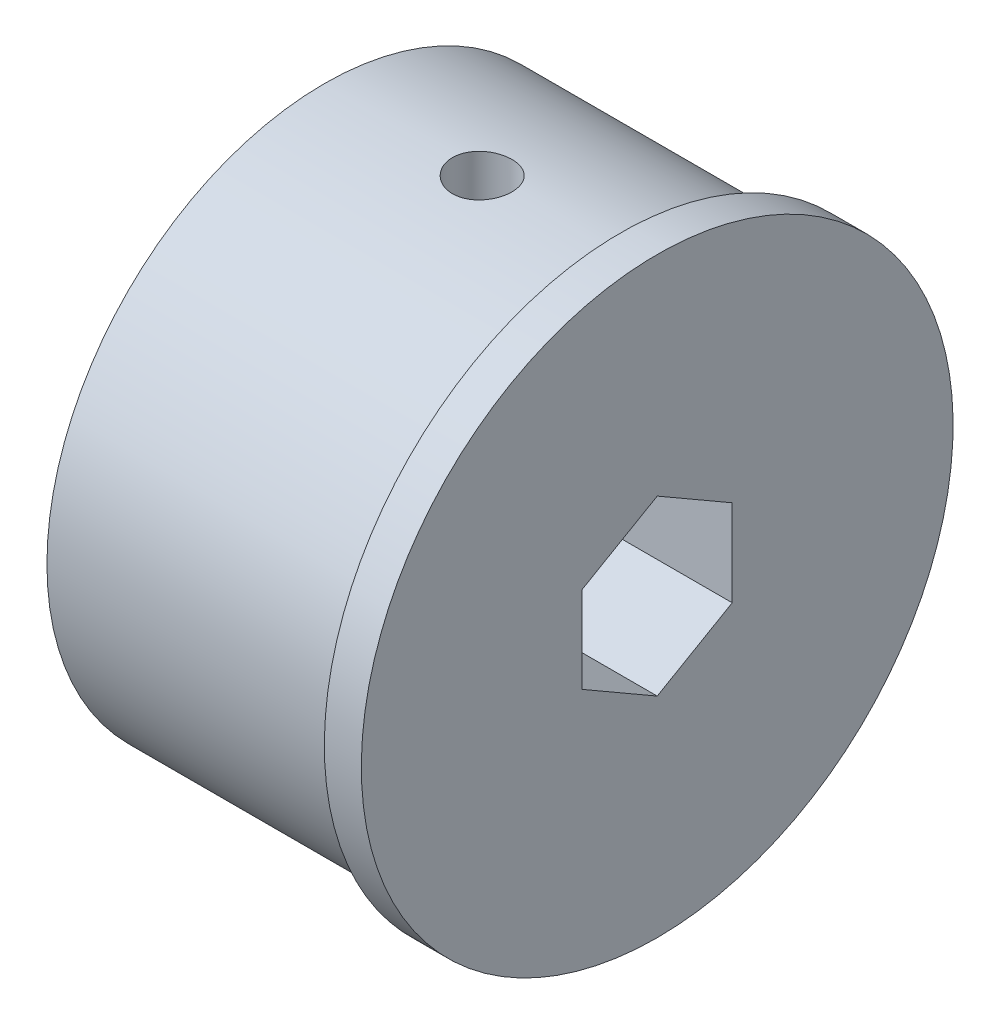
ISO-10303-21;
HEADER;
FILE_DESCRIPTION(('STEP AP214'),'2;1');
FILE_NAME('part.step','',(''),(''),'','','');
FILE_SCHEMA(('AUTOMOTIVE_DESIGN { 1 0 10303 214 1 1 1 1 }'));
ENDSEC;
DATA;
#1=APPLICATION_CONTEXT('core data for automotive mechanical design processes');
#2=APPLICATION_PROTOCOL_DEFINITION('international standard','automotive_design',2000,#1);
#3=PRODUCT_CONTEXT('',#1,'mechanical');
#4=PRODUCT('Part','Part','',(#3));
#5=PRODUCT_RELATED_PRODUCT_CATEGORY('part','',(#4));
#6=PRODUCT_DEFINITION_FORMATION('','',#4);
#7=PRODUCT_DEFINITION_CONTEXT('part definition',#1,'design');
#8=PRODUCT_DEFINITION('design','',#6,#7);
#9=PRODUCT_DEFINITION_SHAPE('','',#8);
#10=(LENGTH_UNIT() NAMED_UNIT(*) SI_UNIT(.MILLI.,.METRE.));
#11=(NAMED_UNIT(*) PLANE_ANGLE_UNIT() SI_UNIT($,.RADIAN.));
#12=(NAMED_UNIT(*) SI_UNIT($,.STERADIAN.) SOLID_ANGLE_UNIT());
#13=UNCERTAINTY_MEASURE_WITH_UNIT(LENGTH_MEASURE(1.E-05),#10,'distance_accuracy_value','');
#14=(GEOMETRIC_REPRESENTATION_CONTEXT(3) GLOBAL_UNCERTAINTY_ASSIGNED_CONTEXT((#13)) GLOBAL_UNIT_ASSIGNED_CONTEXT((#10,
#11,#12)) REPRESENTATION_CONTEXT('',''));
#15=CARTESIAN_POINT('',(0.,0.,0.));
#16=DIRECTION('',(0.,0.,1.));
#17=DIRECTION('',(1.,0.,0.));
#18=AXIS2_PLACEMENT_3D('',#15,#16,#17);
#19=CARTESIAN_POINT('',(280.9875,67.5337049223977,336.106505881662));
#20=DIRECTION('',(-1.,0.,0.));
#21=DIRECTION('',(0.,-1.,0.));
#22=AXIS2_PLACEMENT_3D('',#19,#20,#21);
#23=PLANE('',#22);
#24=DIRECTION('',(0.,0.5,0.866025403784442));
#25=VECTOR('',#24,1.);
#26=CARTESIAN_POINT('',(280.9875,61.9586663855354,339.325255881662));
#27=LINE('',#26,#25);
#28=CARTESIAN_POINT('',(280.9875,60.1003202065813,336.106505881662));
#29=VERTEX_POINT('',#28);
#30=CARTESIAN_POINT('',(280.9875,63.8170125644895,342.544005881662));
#31=VERTEX_POINT('',#30);
#32=EDGE_CURVE('E303',#29,#31,#27,.T.);
#33=ORIENTED_EDGE('',*,*,#32,.F.);
#34=DIRECTION('',(0.,-0.500000000000006,0.866025403784435));
#35=VECTOR('',#34,1.);
#36=CARTESIAN_POINT('',(280.9875,61.9586663855353,332.887755881662));
#37=LINE('',#36,#35);
#38=CARTESIAN_POINT('',(280.9875,63.8170125644894,329.669005881662));
#39=VERTEX_POINT('',#38);
#40=EDGE_CURVE('E145',#39,#29,#37,.T.);
#41=ORIENTED_EDGE('',*,*,#40,.F.);
#42=DIRECTION('',(0.,-1.,0.));
#43=VECTOR('',#42,1.);
#44=CARTESIAN_POINT('',(280.9875,67.5337049223977,329.669005881662));
#45=LINE('',#44,#43);
#46=CARTESIAN_POINT('',(280.9875,71.2503972803059,329.669005881662));
#47=VERTEX_POINT('',#46);
#48=EDGE_CURVE('E155',#47,#39,#45,.T.);
#49=ORIENTED_EDGE('',*,*,#48,.F.);
#50=DIRECTION('',(0.,-0.5,-0.866025403784442));
#51=VECTOR('',#50,1.);
#52=CARTESIAN_POINT('',(280.9875,73.10874345926,332.887755881662));
#53=LINE('',#52,#51);
#54=CARTESIAN_POINT('',(280.9875,74.9670896382141,336.106505881662));
#55=VERTEX_POINT('',#54);
#56=EDGE_CURVE('E322',#55,#47,#53,.T.);
#57=ORIENTED_EDGE('',*,*,#56,.F.);
#58=DIRECTION('',(0.,0.5,-0.866025403784436));
#59=VECTOR('',#58,1.);
#60=CARTESIAN_POINT('',(280.9875,73.10874345926,339.325255881662));
#61=LINE('',#60,#59);
#62=CARTESIAN_POINT('',(280.9875,71.2503972803059,342.544005881662));
#63=VERTEX_POINT('',#62);
#64=EDGE_CURVE('E315',#63,#55,#61,.T.);
#65=ORIENTED_EDGE('',*,*,#64,.F.);
#66=DIRECTION('',(0.,1.,0.));
#67=VECTOR('',#66,1.);
#68=CARTESIAN_POINT('',(280.9875,67.5337049223977,342.544005881662));
#69=LINE('',#68,#67);
#70=EDGE_CURVE('E309',#31,#63,#69,.T.);
#71=ORIENTED_EDGE('',*,*,#70,.F.);
#72=EDGE_LOOP('',(#33,#41,#49,#57,#65,#71));
#73=FACE_BOUND('',#72,.T.);
#74=CARTESIAN_POINT('',(280.9875,67.5337049223977,336.106505881662));
#75=DIRECTION('',(-1.,0.,0.));
#76=DIRECTION('',(0.,-1.,0.));
#77=AXIS2_PLACEMENT_3D('',#74,#75,#76);
#78=CIRCLE('',#77,23.8125);
#79=CARTESIAN_POINT('',(280.9875,43.7212049223977,336.106505881662));
#80=VERTEX_POINT('',#79);
#81=EDGE_CURVE('E211',#80,#80,#78,.T.);
#82=ORIENTED_EDGE('',*,*,#81,.T.);
#83=EDGE_LOOP('',(#82));
#84=FACE_BOUND('',#83,.T.);
#85=DIRECTION('',(0.,1.,0.));
#86=VECTOR('',#85,1.);
#87=CARTESIAN_POINT('',(280.9875,51.8587049223977,340.956505881662));
#88=LINE('',#87,#86);
#89=CARTESIAN_POINT('',(280.9875,50.0712049223977,340.956505881662));
#90=VERTEX_POINT('',#89);
#91=CARTESIAN_POINT('',(280.9875,53.6462049223974,340.956505881662));
#92=VERTEX_POINT('',#91);
#93=EDGE_CURVE('E242',#90,#92,#88,.T.);
#94=ORIENTED_EDGE('',*,*,#93,.F.);
#95=DIRECTION('',(0.,0.,-1.));
#96=VECTOR('',#95,1.);
#97=CARTESIAN_POINT('',(280.9875,50.0712049223974,336.106505881662));
#98=LINE('',#97,#96);
#99=CARTESIAN_POINT('',(280.9875,50.0712049223977,331.256505881662));
#100=VERTEX_POINT('',#99);
#101=EDGE_CURVE('E175',#90,#100,#98,.T.);
#102=ORIENTED_EDGE('',*,*,#101,.T.);
#103=DIRECTION('',(0.,1.,0.));
#104=VECTOR('',#103,1.);
#105=CARTESIAN_POINT('',(280.9875,51.8587049223977,331.256505881662));
#106=LINE('',#105,#104);
#107=CARTESIAN_POINT('',(280.9875,53.6462049223974,331.256505881662));
#108=VERTEX_POINT('',#107);
#109=EDGE_CURVE('E226',#100,#108,#106,.T.);
#110=ORIENTED_EDGE('',*,*,#109,.T.);
#111=DIRECTION('',(0.,0.,-1.));
#112=VECTOR('',#111,1.);
#113=CARTESIAN_POINT('',(280.9875,53.6462049223974,336.106505881662));
#114=LINE('',#113,#112);
#115=EDGE_CURVE('E246',#92,#108,#114,.T.);
#116=ORIENTED_EDGE('',*,*,#115,.F.);
#117=EDGE_LOOP('',(#94,#102,#110,#116));
#118=FACE_BOUND('',#117,.T.);
#119=DIRECTION('',(0.,0.,-1.));
#120=VECTOR('',#119,1.);
#121=CARTESIAN_POINT('',(280.9875,84.9962049223977,336.106505881662));
#122=LINE('',#121,#120);
#123=CARTESIAN_POINT('',(280.9875,84.9962049223977,340.956505881662));
#124=VERTEX_POINT('',#123);
#125=CARTESIAN_POINT('',(280.9875,84.9962049223977,331.256505881662));
#126=VERTEX_POINT('',#125);
#127=EDGE_CURVE('E202',#124,#126,#122,.T.);
#128=ORIENTED_EDGE('',*,*,#127,.F.);
#129=DIRECTION('',(0.,-1.,0.));
#130=VECTOR('',#129,1.);
#131=CARTESIAN_POINT('',(280.9875,83.2087049223977,340.956505881662));
#132=LINE('',#131,#130);
#133=CARTESIAN_POINT('',(280.9875,81.4212049223977,340.956505881662));
#134=VERTEX_POINT('',#133);
#135=EDGE_CURVE('E181',#124,#134,#132,.T.);
#136=ORIENTED_EDGE('',*,*,#135,.T.);
#137=DIRECTION('',(0.,0.,-1.));
#138=VECTOR('',#137,1.);
#139=CARTESIAN_POINT('',(280.9875,81.4212049223977,336.106505881662));
#140=LINE('',#139,#138);
#141=CARTESIAN_POINT('',(280.9875,81.4212049223977,331.256505881662));
#142=VERTEX_POINT('',#141);
#143=EDGE_CURVE('E194',#134,#142,#140,.T.);
#144=ORIENTED_EDGE('',*,*,#143,.T.);
#145=DIRECTION('',(0.,-1.,0.));
#146=VECTOR('',#145,1.);
#147=CARTESIAN_POINT('',(280.9875,83.2087049223977,331.256505881662));
#148=LINE('',#147,#146);
#149=EDGE_CURVE('E198',#126,#142,#148,.T.);
#150=ORIENTED_EDGE('',*,*,#149,.F.);
#151=EDGE_LOOP('',(#128,#136,#144,#150));
#152=FACE_BOUND('',#151,.T.);
#153=ADVANCED_FACE('F17',(#73,#84,#118,#152),#23,.T.);
#154=CARTESIAN_POINT('',(306.3875,67.5337049223977,336.106505881662));
#155=DIRECTION('',(1.,0.,0.));
#156=DIRECTION('',(0.,1.,0.));
#157=AXIS2_PLACEMENT_3D('',#154,#155,#156);
#158=CYLINDRICAL_SURFACE('',#157,25.4);
#159=CARTESIAN_POINT('',(306.3875,67.5337049223977,336.106505881662));
#160=DIRECTION('',(-1.,0.,0.));
#161=DIRECTION('',(0.,-1.,0.));
#162=AXIS2_PLACEMENT_3D('',#159,#160,#161);
#163=CIRCLE('',#162,25.4);
#164=CARTESIAN_POINT('',(306.3875,42.1337049223977,336.106505881662));
#165=VERTEX_POINT('',#164);
#166=EDGE_CURVE('E272',#165,#165,#163,.T.);
#167=ORIENTED_EDGE('',*,*,#166,.F.);
#168=EDGE_LOOP('',(#167));
#169=FACE_BOUND('',#168,.T.);
#170=CARTESIAN_POINT('',(309.5625,67.5337049223977,336.106505881662));
#171=DIRECTION('',(-1.,0.,0.));
#172=DIRECTION('',(0.,-1.,0.));
#173=AXIS2_PLACEMENT_3D('',#170,#171,#172);
#174=CIRCLE('',#173,25.4);
#175=CARTESIAN_POINT('',(309.5625,42.1337049223977,336.106505881662));
#176=VERTEX_POINT('',#175);
#177=EDGE_CURVE('E266',#176,#176,#174,.T.);
#178=ORIENTED_EDGE('',*,*,#177,.T.);
#179=EDGE_LOOP('',(#178));
#180=FACE_BOUND('',#179,.T.);
#181=ADVANCED_FACE('F19',(#169,#180),#158,.T.);
#182=CARTESIAN_POINT('',(306.3875,186.166852461199,298.45));
#183=DIRECTION('',(-1.,0.,0.));
#184=DIRECTION('',(0.,-1.,0.));
#185=AXIS2_PLACEMENT_3D('',#182,#183,#184);
#186=PLANE('',#185);
#187=CARTESIAN_POINT('',(306.3875,67.5337049223977,336.106505881662));
#188=DIRECTION('',(-1.,0.,0.));
#189=DIRECTION('',(0.,-1.,0.));
#190=AXIS2_PLACEMENT_3D('',#187,#188,#189);
#191=CIRCLE('',#190,23.8125);
#192=CARTESIAN_POINT('',(306.3875,43.7212049223977,336.106505881662));
#193=VERTEX_POINT('',#192);
#194=EDGE_CURVE('E267',#193,#193,#191,.T.);
#195=ORIENTED_EDGE('',*,*,#194,.F.);
#196=EDGE_LOOP('',(#195));
#197=FACE_BOUND('',#196,.T.);
#198=ORIENTED_EDGE('',*,*,#166,.T.);
#199=EDGE_LOOP('',(#198));
#200=FACE_BOUND('',#199,.T.);
#201=ADVANCED_FACE('F433',(#197,#200),#186,.T.);
#202=CARTESIAN_POINT('',(309.5625,186.166852461199,298.45));
#203=DIRECTION('',(-1.,0.,0.));
#204=DIRECTION('',(0.,-1.,0.));
#205=AXIS2_PLACEMENT_3D('',#202,#203,#204);
#206=PLANE('',#205);
#207=DIRECTION('',(0.,-0.500000000000006,0.866025403784435));
#208=VECTOR('',#207,1.);
#209=CARTESIAN_POINT('',(309.5625,107.922698625875,253.27571672066));
#210=LINE('',#209,#208);
#211=CARTESIAN_POINT('',(309.5625,63.8170125644894,329.669005881662));
#212=VERTEX_POINT('',#211);
#213=CARTESIAN_POINT('',(309.5625,60.1003202065812,336.106505881662));
#214=VERTEX_POINT('',#213);
#215=EDGE_CURVE('E271',#212,#214,#210,.T.);
#216=ORIENTED_EDGE('',*,*,#215,.T.);
#217=DIRECTION('',(0.,0.5,0.866025403784442));
#218=VECTOR('',#217,1.);
#219=CARTESIAN_POINT('',(309.5625,75.3112079145966,362.452536220169));
#220=LINE('',#219,#218);
#221=CARTESIAN_POINT('',(309.5625,63.8170125644895,342.544005881662));
#222=VERTEX_POINT('',#221);
#223=EDGE_CURVE('E26',#214,#222,#220,.T.);
#224=ORIENTED_EDGE('',*,*,#223,.T.);
#225=DIRECTION('',(0.,1.,0.));
#226=VECTOR('',#225,1.);
#227=CARTESIAN_POINT('',(309.5625,186.166852461199,342.544005881662));
#228=LINE('',#227,#226);
#229=CARTESIAN_POINT('',(309.5625,71.2503972803059,342.544005881662));
#230=VERTEX_POINT('',#229);
#231=EDGE_CURVE('E294',#222,#230,#228,.T.);
#232=ORIENTED_EDGE('',*,*,#231,.T.);
#233=DIRECTION('',(0.,0.5,-0.866025403784436));
#234=VECTOR('',#233,1.);
#235=CARTESIAN_POINT('',(309.5625,119.0727756996,259.713216720661));
#236=LINE('',#235,#234);
#237=CARTESIAN_POINT('',(309.5625,74.9670896382141,336.106505881662));
#238=VERTEX_POINT('',#237);
#239=EDGE_CURVE('E290',#230,#238,#236,.T.);
#240=ORIENTED_EDGE('',*,*,#239,.T.);
#241=DIRECTION('',(0.,-0.5,-0.866025403784442));
#242=VECTOR('',#241,1.);
#243=CARTESIAN_POINT('',(309.5625,86.4612849883213,356.01503622017));
#244=LINE('',#243,#242);
#245=CARTESIAN_POINT('',(309.5625,71.2503972803059,329.669005881662));
#246=VERTEX_POINT('',#245);
#247=EDGE_CURVE('E286',#238,#246,#244,.T.);
#248=ORIENTED_EDGE('',*,*,#247,.T.);
#249=DIRECTION('',(0.,-1.,0.));
#250=VECTOR('',#249,1.);
#251=CARTESIAN_POINT('',(309.5625,186.166852461199,329.669005881662));
#252=LINE('',#251,#250);
#253=EDGE_CURVE('E282',#246,#212,#252,.T.);
#254=ORIENTED_EDGE('',*,*,#253,.T.);
#255=EDGE_LOOP('',(#216,#224,#232,#240,#248,#254));
#256=FACE_BOUND('',#255,.T.);
#257=ORIENTED_EDGE('',*,*,#177,.F.);
#258=EDGE_LOOP('',(#257));
#259=FACE_BOUND('',#258,.T.);
#260=ADVANCED_FACE('F300',(#256,#259),#206,.F.);
#261=CARTESIAN_POINT('',(280.9875,67.5337049223977,336.106505881662));
#262=DIRECTION('',(1.,0.,0.));
#263=DIRECTION('',(0.,1.,0.));
#264=AXIS2_PLACEMENT_3D('',#261,#262,#263);
#265=CYLINDRICAL_SURFACE('',#264,23.8125);
#266=CARTESIAN_POINT('',(291.985538685969,91.3462049223977,336.106505881662));
#267=CARTESIAN_POINT('',(291.985544847417,91.3462031722386,335.963559626922));
#268=CARTESIAN_POINT('',(291.997586197786,91.3449041092848,335.820520235967));
#269=CARTESIAN_POINT('',(292.045437526688,91.3398468153479,335.538410963963));
#270=CARTESIAN_POINT('',(292.081273328868,91.3360859126418,335.399345567029));
#271=CARTESIAN_POINT('',(292.17565493709,91.3265292517013,335.129310060398));
#272=CARTESIAN_POINT('',(292.234186608062,91.3207347602062,334.998334970772));
#273=CARTESIAN_POINT('',(292.372270048498,91.3077579258004,334.748095360035));
#274=CARTESIAN_POINT('',(292.451817791344,91.3005758488178,334.628828601641));
#275=CARTESIAN_POINT('',(292.630025441006,91.2855946891096,334.404873879081));
#276=CARTESIAN_POINT('',(292.728754154696,91.277793446729,334.300240805865));
#277=CARTESIAN_POINT('',(292.942374085516,91.2624709422397,334.108995668204));
#278=CARTESIAN_POINT('',(293.057266069136,91.2549496934301,334.022384458869));
#279=CARTESIAN_POINT('',(293.300298662452,91.2410169691063,333.869444210491));
#280=CARTESIAN_POINT('',(293.428471028104,91.2346082564592,333.80316536055));
#281=CARTESIAN_POINT('',(293.694206359069,91.2236535562576,333.693091715532));
#282=CARTESIAN_POINT('',(293.831769059627,91.2191075162113,333.649296286843));
#283=CARTESIAN_POINT('',(294.111817233407,91.2124127673932,333.585596627741));
#284=CARTESIAN_POINT('',(294.254281658292,91.2102548739178,333.565600842409));
#285=CARTESIAN_POINT('',(294.540559459744,91.2085523616692,333.549784985192));
#286=CARTESIAN_POINT('',(294.684372795759,91.2090076645849,333.553964188843));
#287=CARTESIAN_POINT('',(294.968633138449,91.21247170691,333.586304300348));
#288=CARTESIAN_POINT('',(295.109091692955,91.2154697775931,333.61436500993));
#289=CARTESIAN_POINT('',(295.383294313009,91.2236648946824,333.693515572669));
#290=CARTESIAN_POINT('',(295.517038275678,91.2288619747691,333.744605778551));
#291=CARTESIAN_POINT('',(295.774330342815,91.2408817674494,333.868474896857));
#292=CARTESIAN_POINT('',(295.897857001513,91.247707788091,333.941298020838));
#293=CARTESIAN_POINT('',(296.130973231234,91.2622136182818,334.106534065044));
#294=CARTESIAN_POINT('',(296.24056233303,91.2698934565595,334.198947644529));
#295=CARTESIAN_POINT('',(296.443274690732,91.2852891197195,334.401299800676));
#296=CARTESIAN_POINT('',(296.536311633622,91.2930049296104,334.511324866995));
#297=CARTESIAN_POINT('',(296.70260889482,91.3075664856099,334.745477139078));
#298=CARTESIAN_POINT('',(296.775869185621,91.3144122305083,334.869604364457));
#299=CARTESIAN_POINT('',(296.900531022904,91.3264650718349,335.128499035533));
#300=CARTESIAN_POINT('',(296.951927918175,91.3316718195222,335.263268738084));
#301=CARTESIAN_POINT('',(297.031339345765,91.3398565749097,335.539593346709));
#302=CARTESIAN_POINT('',(297.059354682002,91.3428346592368,335.681148019321));
#303=CARTESIAN_POINT('',(297.091097611909,91.3462166669786,335.966277191062));
#304=CARTESIAN_POINT('',(297.094944256107,91.3466332078687,336.10983829299));
#305=CARTESIAN_POINT('',(297.07855368937,91.3448790911161,336.395560940886));
#306=CARTESIAN_POINT('',(297.058316853279,91.3427084737409,336.537722508602));
#307=CARTESIAN_POINT('',(296.994432580574,91.336031949129,336.816264993706));
#308=CARTESIAN_POINT('',(296.950841158253,91.3315316303816,336.952658903384));
#309=CARTESIAN_POINT('',(296.84154285548,91.3207002830021,337.216198893231));
#310=CARTESIAN_POINT('',(296.775835409782,91.3143692075798,337.343344736937));
#311=CARTESIAN_POINT('',(296.623876925259,91.3005524171546,337.585315920108));
#312=CARTESIAN_POINT('',(296.537547988566,91.2930623628302,337.700092087688));
#313=CARTESIAN_POINT('',(296.346908377424,91.2777812512366,337.913567428774));
#314=CARTESIAN_POINT('',(296.242597182865,91.2699901852663,338.012266137104));
#315=CARTESIAN_POINT('',(296.018433269481,91.2549469249972,338.191200635593));
#316=CARTESIAN_POINT('',(295.898517831631,91.2476971019459,338.271358080892));
#317=CARTESIAN_POINT('',(295.646857397983,91.2345940829335,338.410395398889));
#318=CARTESIAN_POINT('',(295.515112584629,91.2287408654376,338.469275599674));
#319=CARTESIAN_POINT('',(295.243797599001,91.21910899278,338.563957017444));
#320=CARTESIAN_POINT('',(295.104243619551,91.2153262081919,338.599804198243));
#321=CARTESIAN_POINT('',(294.821054525024,91.2102509637193,338.647550864463));
#322=CARTESIAN_POINT('',(294.677419546259,91.2089584207552,338.659451148802));
#323=CARTESIAN_POINT('',(294.390924571933,91.2090119432375,338.658954187247));
#324=CARTESIAN_POINT('',(294.248064344544,91.2103446441069,338.64668000863));
#325=CARTESIAN_POINT('',(293.966448367388,91.2154699346672,338.598441261144));
#326=CARTESIAN_POINT('',(293.827692621274,91.2192625265469,338.562476671194));
#327=CARTESIAN_POINT('',(293.55822943279,91.228876450762,338.467913204498));
#328=CARTESIAN_POINT('',(293.42752048687,91.2346974027351,338.409318571159));
#329=CARTESIAN_POINT('',(293.177772259502,91.2477129094745,338.271170747382));
#330=CARTESIAN_POINT('',(293.058732969496,91.2549074632334,338.191617572311));
#331=CARTESIAN_POINT('',(292.835072636408,91.2699034365026,338.013349862327));
#332=CARTESIAN_POINT('',(292.73052493268,91.2777076511241,337.91454354522));
#333=CARTESIAN_POINT('',(292.539442043279,91.2930182592207,337.700759764275));
#334=CARTESIAN_POINT('',(292.452911158617,91.300524581237,337.585778450061));
#335=CARTESIAN_POINT('',(292.300118980407,91.3144163420857,337.342544233568));
#336=CARTESIAN_POINT('',(292.23391614565,91.3207985261254,337.214254448729));
#337=CARTESIAN_POINT('',(292.124082415144,91.3316883725506,336.948389829683));
#338=CARTESIAN_POINT('',(292.080426313232,91.3361981271109,336.810825559346));
#339=CARTESIAN_POINT('',(292.027696191281,91.3417139563212,336.578167287774));
#340=CARTESIAN_POINT('',(292.011909020293,91.3433901230025,336.48455561393));
#341=CARTESIAN_POINT('',(291.990828249467,91.345636183908,336.29614491585));
#342=CARTESIAN_POINT('',(291.985534598056,91.3462060835692,336.201345897453));
#343=CARTESIAN_POINT('',(291.985538685969,91.3462049223977,336.106505881662));
#344=B_SPLINE_CURVE_WITH_KNOTS('',3,(#266,#267,#268,#269,#270,#271,#272,#273,#274,#275,#276,
#277,#278,#279,#280,#281,#282,#283,#284,#285,#286,#287,#288,#289,#290,#291,#292,#293,#294,#295,
#296,#297,#298,#299,#300,#301,#302,#303,#304,#305,#306,#307,#308,#309,#310,#311,#312,#313,#314,
#315,#316,#317,#318,#319,#320,#321,#322,#323,#324,#325,#326,#327,#328,#329,#330,#331,#332,#333,
#334,#335,#336,#337,#338,#339,#340,#341,#342,#343),.UNSPECIFIED.,.T.,.F.,(4,2,2,2,2,2,2,2,2,2,2,
2,2,2,2,2,2,2,2,2,2,2,2,2,2,2,2,2,2,2,2,2,2,2,2,2,2,2,4),(0.,0.428492418047313,
0.857450632167599,1.28614211751598,1.71475152631267,2.14492784008853,2.57512456044332,
3.00637480364868,3.43761289300658,3.86718663351655,4.2967475008211,4.72451491913662,
5.15228888944797,5.58093908769758,6.0096037131949,6.4404420146657,6.87128091539105,
7.30221142685386,7.73312712118821,8.16191852914492,8.59070326332236,9.01846416210682,
9.44623599451206,9.87565003029716,10.3050764883351,10.7362855986852,11.167488059658,
11.5978273348086,12.0281522526955,12.4562921358358,12.8844323999443,13.3124924214867,
13.7405521291202,14.1707047093826,14.6009598590843,15.0324409791845,15.4634386742491,
15.7477303298348,16.0320205882109),.UNSPECIFIED.);
#345=CARTESIAN_POINT('',(291.985538685969,91.3462049223977,336.106505881662));
#346=VERTEX_POINT('',#345);
#347=EDGE_CURVE('E330',#346,#346,#344,.T.);
#348=ORIENTED_EDGE('',*,*,#347,.T.);
#349=EDGE_LOOP('',(#348));
#350=FACE_BOUND('',#349,.T.);
#351=CARTESIAN_POINT('',(291.985538685969,43.7212049223981,336.106505881662));
#352=CARTESIAN_POINT('',(291.985544847417,43.7212066725573,336.249452136402));
#353=CARTESIAN_POINT('',(291.997586197786,43.7225057355107,336.392491527357));
#354=CARTESIAN_POINT('',(292.045437526688,43.7275630294474,336.674600799361));
#355=CARTESIAN_POINT('',(292.081273328868,43.7313239321535,336.813666196294));
#356=CARTESIAN_POINT('',(292.17565493709,43.7408805930941,337.083701702925));
#357=CARTESIAN_POINT('',(292.234186608062,43.7466750845891,337.214676792552));
#358=CARTESIAN_POINT('',(292.372270048497,43.7596519189949,337.464916403288));
#359=CARTESIAN_POINT('',(292.451817791344,43.7668339959776,337.584183161683));
#360=CARTESIAN_POINT('',(292.630025441006,43.7818151556858,337.808137884243));
#361=CARTESIAN_POINT('',(292.728754154696,43.7896163980664,337.912770957459));
#362=CARTESIAN_POINT('',(292.942374085516,43.8049389025557,338.10401609512));
#363=CARTESIAN_POINT('',(293.057266069136,43.8124601513652,338.190627304455));
#364=CARTESIAN_POINT('',(293.300298662452,43.8263928756891,338.343567552833));
#365=CARTESIAN_POINT('',(293.428471028104,43.8328015883362,338.409846402774));
#366=CARTESIAN_POINT('',(293.694206359069,43.8437562885378,338.519920047792));
#367=CARTESIAN_POINT('',(293.831769059627,43.8483023285841,338.56371547648));
#368=CARTESIAN_POINT('',(294.111817233407,43.8549970774021,338.627415135582));
#369=CARTESIAN_POINT('',(294.254281658292,43.8571549708776,338.647410920915));
#370=CARTESIAN_POINT('',(294.540559459744,43.8588574831262,338.663226778132));
#371=CARTESIAN_POINT('',(294.684372795758,43.8584021802105,338.65904757448));
#372=CARTESIAN_POINT('',(294.968633138449,43.8549381378854,338.626707462976));
#373=CARTESIAN_POINT('',(295.109091692956,43.8519400672023,338.598646753394));
#374=CARTESIAN_POINT('',(295.383294313009,43.8437449501129,338.519496190655));
#375=CARTESIAN_POINT('',(295.517038275678,43.8385478700263,338.468405984772));
#376=CARTESIAN_POINT('',(295.774330342815,43.826528077346,338.344536866466));
#377=CARTESIAN_POINT('',(295.897857001514,43.8197020567044,338.271713742486));
#378=CARTESIAN_POINT('',(296.130973231234,43.8051962265136,338.106477698279));
#379=CARTESIAN_POINT('',(296.24056233303,43.7975163882358,338.014064118795));
#380=CARTESIAN_POINT('',(296.443274690732,43.7821207250759,337.811711962647));
#381=CARTESIAN_POINT('',(296.536311633622,43.774404915185,337.701686896329));
#382=CARTESIAN_POINT('',(296.70260889482,43.7598433591855,337.467534624246));
#383=CARTESIAN_POINT('',(296.775869185621,43.7529976142871,337.343407398867));
#384=CARTESIAN_POINT('',(296.900531022904,43.7409447729605,337.084512727791));
#385=CARTESIAN_POINT('',(296.951927918175,43.7357380252732,336.94974302524));
#386=CARTESIAN_POINT('',(297.031339345765,43.7275532698857,336.673418416615));
#387=CARTESIAN_POINT('',(297.059354682002,43.7245751855586,336.531863744003));
#388=CARTESIAN_POINT('',(297.091097611909,43.7211931778168,336.246734572261));
#389=CARTESIAN_POINT('',(297.094944256107,43.7207766369268,336.103173470334));
#390=CARTESIAN_POINT('',(297.07855368937,43.7225307536793,335.817450822438));
#391=CARTESIAN_POINT('',(297.058316853279,43.7247013710545,335.675289254721));
#392=CARTESIAN_POINT('',(296.994432580574,43.7313778956663,335.396746769618));
#393=CARTESIAN_POINT('',(296.950841158253,43.7358782144138,335.26035285994));
#394=CARTESIAN_POINT('',(296.84154285548,43.7467095617934,334.996812870092));
#395=CARTESIAN_POINT('',(296.775835409782,43.7530406372156,334.869667026387));
#396=CARTESIAN_POINT('',(296.623876925259,43.7668574276407,334.627695843215));
#397=CARTESIAN_POINT('',(296.537547988566,43.7743474819652,334.512919675636));
#398=CARTESIAN_POINT('',(296.346908377424,43.7896285935588,334.299444334549));
#399=CARTESIAN_POINT('',(296.242597182865,43.7974196595292,334.200745626219));
#400=CARTESIAN_POINT('',(296.018433269481,43.8124629197983,334.021811127731));
#401=CARTESIAN_POINT('',(295.898517831631,43.8197127428495,333.941653682432));
#402=CARTESIAN_POINT('',(295.646857397982,43.8328157618619,333.802616364435));
#403=CARTESIAN_POINT('',(295.515112584628,43.8386689793577,333.74373616365));
#404=CARTESIAN_POINT('',(295.243797599001,43.8483008520153,333.64905474588));
#405=CARTESIAN_POINT('',(295.104243619551,43.8520836366035,333.613207565081));
#406=CARTESIAN_POINT('',(294.821054525024,43.8571588810761,333.565460898861));
#407=CARTESIAN_POINT('',(294.677419546259,43.8584514240403,333.553560614521));
#408=CARTESIAN_POINT('',(294.390924571933,43.8583979015579,333.554057576077));
#409=CARTESIAN_POINT('',(294.248064344544,43.8570652006885,333.566331754694));
#410=CARTESIAN_POINT('',(293.966448367388,43.8519399101282,333.61457050218));
#411=CARTESIAN_POINT('',(293.827692621274,43.8481473182485,333.650535092129));
#412=CARTESIAN_POINT('',(293.55822943279,43.8385333940334,333.745098558826));
#413=CARTESIAN_POINT('',(293.42752048687,43.8327124420603,333.803693192164));
#414=CARTESIAN_POINT('',(293.177772259502,43.8196969353209,333.941841015943));
#415=CARTESIAN_POINT('',(293.058732969496,43.812502381562,334.021394191013));
#416=CARTESIAN_POINT('',(292.835072636408,43.7975064082928,334.199661900997));
#417=CARTESIAN_POINT('',(292.73052493268,43.7897021936713,334.298468218104));
#418=CARTESIAN_POINT('',(292.539442043279,43.7743915855747,334.512251999049));
#419=CARTESIAN_POINT('',(292.452911158617,43.7668852635585,334.627233313264));
#420=CARTESIAN_POINT('',(292.300118980407,43.7529935027098,334.870467529756));
#421=CARTESIAN_POINT('',(292.23391614565,43.74661131867,334.998757314595));
#422=CARTESIAN_POINT('',(292.124082415144,43.7357214722448,335.26462193364));
#423=CARTESIAN_POINT('',(292.080426313232,43.7312117176844,335.402186203977));
#424=CARTESIAN_POINT('',(292.027696191281,43.7256958884741,335.634844475549));
#425=CARTESIAN_POINT('',(292.011909020293,43.7240197217928,335.728456149394));
#426=CARTESIAN_POINT('',(291.990828249467,43.7217736608875,335.916866847474));
#427=CARTESIAN_POINT('',(291.985534598056,43.7212037612265,336.011665865871));
#428=CARTESIAN_POINT('',(291.985538685969,43.7212049223981,336.106505881662));
#429=B_SPLINE_CURVE_WITH_KNOTS('',3,(#351,#352,#353,#354,#355,#356,#357,#358,#359,#360,#361,
#362,#363,#364,#365,#366,#367,#368,#369,#370,#371,#372,#373,#374,#375,#376,#377,#378,#379,#380,
#381,#382,#383,#384,#385,#386,#387,#388,#389,#390,#391,#392,#393,#394,#395,#396,#397,#398,#399,
#400,#401,#402,#403,#404,#405,#406,#407,#408,#409,#410,#411,#412,#413,#414,#415,#416,#417,#418,
#419,#420,#421,#422,#423,#424,#425,#426,#427,#428),.UNSPECIFIED.,.T.,.F.,(4,2,2,2,2,2,2,2,2,2,2,
2,2,2,2,2,2,2,2,2,2,2,2,2,2,2,2,2,2,2,2,2,2,2,2,2,2,2,4),(0.,0.428492418047028,0.85745063216706,
1.28614211751562,1.71475152631264,2.14492784008846,2.57512456044329,3.00637480364843,
3.43761289300639,3.86718663351639,4.296747500821,4.72451491913659,5.15228888944796,
5.58093908769769,6.009603713195,6.4404420146657,6.87128091539078,7.30221142685363,
7.73312712118793,8.16191852914491,8.59070326332263,9.01846416210705,9.44623599451224,
9.87565003029729,10.3050764883352,10.7362855986852,11.1674880596578,11.5978273348085,
12.0281522526953,12.4562921358356,12.8844323999441,13.3124924214866,13.7405521291202,
14.1707047093825,14.6009598590842,15.0324409791842,15.4634386742486,15.7477303298346,
16.032020588211),.UNSPECIFIED.);
#430=CARTESIAN_POINT('',(291.985538685969,43.7212049223981,336.106505881662));
#431=VERTEX_POINT('',#430);
#432=EDGE_CURVE('E336',#431,#431,#429,.T.);
#433=ORIENTED_EDGE('',*,*,#432,.T.);
#434=EDGE_LOOP('',(#433));
#435=FACE_BOUND('',#434,.T.);
#436=ORIENTED_EDGE('',*,*,#81,.F.);
#437=EDGE_LOOP('',(#436));
#438=FACE_BOUND('',#437,.T.);
#439=ORIENTED_EDGE('',*,*,#194,.T.);
#440=EDGE_LOOP('',(#439));
#441=FACE_BOUND('',#440,.T.);
#442=ADVANCED_FACE('F366',(#350,#435,#438,#441),#265,.T.);
#443=CARTESIAN_POINT('',(300.0375,50.0712049223974,336.106505881662));
#444=DIRECTION('',(0.,1.,0.));
#445=DIRECTION('',(-1.,0.,0.));
#446=AXIS2_PLACEMENT_3D('',#443,#444,#445);
#447=PLANE('',#446);
#448=CARTESIAN_POINT('',(294.538238685969,50.0712049223975,336.106505881662));
#449=DIRECTION('',(0.,1.,0.));
#450=DIRECTION('',(-1.,0.,0.));
#451=AXIS2_PLACEMENT_3D('',#448,#449,#450);
#452=CIRCLE('',#451,2.5527);
#453=CARTESIAN_POINT('',(291.985538685969,50.0712049223975,336.106505881662));
#454=VERTEX_POINT('',#453);
#455=EDGE_CURVE('E355',#454,#454,#452,.T.);
#456=ORIENTED_EDGE('',*,*,#455,.F.);
#457=EDGE_LOOP('',(#456));
#458=FACE_BOUND('',#457,.T.);
#459=ORIENTED_EDGE('',*,*,#101,.F.);
#460=DIRECTION('',(-1.,0.,0.));
#461=VECTOR('',#460,1.);
#462=CARTESIAN_POINT('',(300.0375,50.0712049223977,340.956505881662));
#463=LINE('',#462,#461);
#464=CARTESIAN_POINT('',(300.0375,50.0712049223977,340.956505881662));
#465=VERTEX_POINT('',#464);
#466=EDGE_CURVE('E199',#465,#90,#463,.T.);
#467=ORIENTED_EDGE('',*,*,#466,.F.);
#468=DIRECTION('',(0.,0.,-1.));
#469=VECTOR('',#468,1.);
#470=CARTESIAN_POINT('',(300.0375,50.0712049223974,336.106505881662));
#471=LINE('',#470,#469);
#472=CARTESIAN_POINT('',(300.0375,50.0712049223977,331.256505881662));
#473=VERTEX_POINT('',#472);
#474=EDGE_CURVE('E221',#465,#473,#471,.T.);
#475=ORIENTED_EDGE('',*,*,#474,.T.);
#476=DIRECTION('',(-1.,0.,0.));
#477=VECTOR('',#476,1.);
#478=CARTESIAN_POINT('',(300.0375,50.0712049223977,331.256505881662));
#479=LINE('',#478,#477);
#480=EDGE_CURVE('E238',#473,#100,#479,.T.);
#481=ORIENTED_EDGE('',*,*,#480,.T.);
#482=EDGE_LOOP('',(#459,#467,#475,#481));
#483=FACE_BOUND('',#482,.T.);
#484=ADVANCED_FACE('F425',(#458,#483),#447,.T.);
#485=CARTESIAN_POINT('',(300.0375,51.8587049223977,340.956505881662));
#486=DIRECTION('',(0.,0.,1.));
#487=DIRECTION('',(1.,0.,0.));
#488=AXIS2_PLACEMENT_3D('',#485,#486,#487);
#489=PLANE('',#488);
#490=ORIENTED_EDGE('',*,*,#93,.T.);
#491=DIRECTION('',(-1.,0.,0.));
#492=VECTOR('',#491,1.);
#493=CARTESIAN_POINT('',(300.0375,53.6462049223974,340.956505881662));
#494=LINE('',#493,#492);
#495=CARTESIAN_POINT('',(300.0375,53.6462049223974,340.956505881662));
#496=VERTEX_POINT('',#495);
#497=EDGE_CURVE('E258',#496,#92,#494,.T.);
#498=ORIENTED_EDGE('',*,*,#497,.F.);
#499=DIRECTION('',(0.,1.,0.));
#500=VECTOR('',#499,1.);
#501=CARTESIAN_POINT('',(300.0375,51.8587049223977,340.956505881662));
#502=LINE('',#501,#500);
#503=EDGE_CURVE('E225',#465,#496,#502,.T.);
#504=ORIENTED_EDGE('',*,*,#503,.F.);
#505=ORIENTED_EDGE('',*,*,#466,.T.);
#506=EDGE_LOOP('',(#490,#498,#504,#505));
#507=FACE_BOUND('',#506,.T.);
#508=ADVANCED_FACE('F421',(#507),#489,.F.);
#509=CARTESIAN_POINT('',(300.0375,53.6462049223974,336.106505881662));
#510=DIRECTION('',(0.,1.,0.));
#511=DIRECTION('',(-1.,0.,0.));
#512=AXIS2_PLACEMENT_3D('',#509,#510,#511);
#513=PLANE('',#512);
#514=CARTESIAN_POINT('',(294.538238685969,53.6462049223974,336.106505881662));
#515=DIRECTION('',(0.,1.,0.));
#516=DIRECTION('',(-1.,0.,0.));
#517=AXIS2_PLACEMENT_3D('',#514,#515,#516);
#518=CIRCLE('',#517,2.5527);
#519=CARTESIAN_POINT('',(291.985538685969,53.6462049223974,336.106505881662));
#520=VERTEX_POINT('',#519);
#521=EDGE_CURVE('E360',#520,#520,#518,.T.);
#522=ORIENTED_EDGE('',*,*,#521,.T.);
#523=EDGE_LOOP('',(#522));
#524=FACE_BOUND('',#523,.T.);
#525=ORIENTED_EDGE('',*,*,#115,.T.);
#526=DIRECTION('',(-1.,0.,0.));
#527=VECTOR('',#526,1.);
#528=CARTESIAN_POINT('',(300.0375,53.6462049223974,331.256505881662));
#529=LINE('',#528,#527);
#530=CARTESIAN_POINT('',(300.0375,53.6462049223974,331.256505881662));
#531=VERTEX_POINT('',#530);
#532=EDGE_CURVE('E254',#531,#108,#529,.T.);
#533=ORIENTED_EDGE('',*,*,#532,.F.);
#534=DIRECTION('',(0.,0.,-1.));
#535=VECTOR('',#534,1.);
#536=CARTESIAN_POINT('',(300.0375,53.6462049223974,336.106505881662));
#537=LINE('',#536,#535);
#538=EDGE_CURVE('E230',#496,#531,#537,.T.);
#539=ORIENTED_EDGE('',*,*,#538,.F.);
#540=ORIENTED_EDGE('',*,*,#497,.T.);
#541=EDGE_LOOP('',(#525,#533,#539,#540));
#542=FACE_BOUND('',#541,.T.);
#543=ADVANCED_FACE('F417',(#524,#542),#513,.F.);
#544=CARTESIAN_POINT('',(300.0375,51.8587049223977,331.256505881662));
#545=DIRECTION('',(0.,0.,1.));
#546=DIRECTION('',(1.,0.,0.));
#547=AXIS2_PLACEMENT_3D('',#544,#545,#546);
#548=PLANE('',#547);
#549=ORIENTED_EDGE('',*,*,#109,.F.);
#550=ORIENTED_EDGE('',*,*,#480,.F.);
#551=DIRECTION('',(0.,1.,0.));
#552=VECTOR('',#551,1.);
#553=CARTESIAN_POINT('',(300.0375,51.8587049223977,331.256505881662));
#554=LINE('',#553,#552);
#555=EDGE_CURVE('E234',#473,#531,#554,.T.);
#556=ORIENTED_EDGE('',*,*,#555,.T.);
#557=ORIENTED_EDGE('',*,*,#532,.T.);
#558=EDGE_LOOP('',(#549,#550,#556,#557));
#559=FACE_BOUND('',#558,.T.);
#560=ADVANCED_FACE('F413',(#559),#548,.T.);
#561=CARTESIAN_POINT('',(300.0375,67.5337049223977,336.106505881662));
#562=DIRECTION('',(-1.,0.,0.));
#563=DIRECTION('',(0.,-1.,0.));
#564=AXIS2_PLACEMENT_3D('',#561,#562,#563);
#565=PLANE('',#564);
#566=ORIENTED_EDGE('',*,*,#474,.F.);
#567=ORIENTED_EDGE('',*,*,#503,.T.);
#568=ORIENTED_EDGE('',*,*,#538,.T.);
#569=ORIENTED_EDGE('',*,*,#555,.F.);
#570=EDGE_LOOP('',(#566,#567,#568,#569));
#571=FACE_BOUND('',#570,.T.);
#572=ADVANCED_FACE('F399',(#571),#565,.T.);
#573=CARTESIAN_POINT('',(300.0375,83.2087049223977,340.956505881662));
#574=DIRECTION('',(0.,0.,-1.));
#575=DIRECTION('',(-1.,0.,0.));
#576=AXIS2_PLACEMENT_3D('',#573,#574,#575);
#577=PLANE('',#576);
#578=ORIENTED_EDGE('',*,*,#135,.F.);
#579=DIRECTION('',(-1.,0.,0.));
#580=VECTOR('',#579,1.);
#581=CARTESIAN_POINT('',(300.0375,84.9962049223977,340.956505881662));
#582=LINE('',#581,#580);
#583=CARTESIAN_POINT('',(300.0375,84.9962049223977,340.956505881662));
#584=VERTEX_POINT('',#583);
#585=EDGE_CURVE('E208',#584,#124,#582,.T.);
#586=ORIENTED_EDGE('',*,*,#585,.F.);
#587=DIRECTION('',(0.,-1.,0.));
#588=VECTOR('',#587,1.);
#589=CARTESIAN_POINT('',(300.0375,83.2087049223977,340.956505881662));
#590=LINE('',#589,#588);
#591=CARTESIAN_POINT('',(300.0375,81.4212049223977,340.956505881662));
#592=VERTEX_POINT('',#591);
#593=EDGE_CURVE('E189',#584,#592,#590,.T.);
#594=ORIENTED_EDGE('',*,*,#593,.T.);
#595=DIRECTION('',(-1.,0.,0.));
#596=VECTOR('',#595,1.);
#597=CARTESIAN_POINT('',(300.0375,81.4212049223977,340.956505881662));
#598=LINE('',#597,#596);
#599=EDGE_CURVE('E193',#592,#134,#598,.T.);
#600=ORIENTED_EDGE('',*,*,#599,.T.);
#601=EDGE_LOOP('',(#578,#586,#594,#600));
#602=FACE_BOUND('',#601,.T.);
#603=ADVANCED_FACE('F395',(#602),#577,.T.);
#604=CARTESIAN_POINT('',(300.0375,84.9962049223977,336.106505881662));
#605=DIRECTION('',(0.,1.,0.));
#606=DIRECTION('',(-1.,0.,0.));
#607=AXIS2_PLACEMENT_3D('',#604,#605,#606);
#608=PLANE('',#607);
#609=CARTESIAN_POINT('',(294.538238685969,84.9962049223978,336.106505881662));
#610=DIRECTION('',(0.,1.,0.));
#611=DIRECTION('',(-1.,0.,0.));
#612=AXIS2_PLACEMENT_3D('',#609,#610,#611);
#613=CIRCLE('',#612,2.5527);
#614=CARTESIAN_POINT('',(291.985538685969,84.9962049223978,336.106505881662));
#615=VERTEX_POINT('',#614);
#616=EDGE_CURVE('E618',#615,#615,#613,.T.);
#617=ORIENTED_EDGE('',*,*,#616,.T.);
#618=EDGE_LOOP('',(#617));
#619=FACE_BOUND('',#618,.T.);
#620=ORIENTED_EDGE('',*,*,#127,.T.);
#621=DIRECTION('',(-1.,0.,0.));
#622=VECTOR('',#621,1.);
#623=CARTESIAN_POINT('',(300.0375,84.9962049223977,331.256505881662));
#624=LINE('',#623,#622);
#625=CARTESIAN_POINT('',(300.0375,84.9962049223977,331.256505881662));
#626=VERTEX_POINT('',#625);
#627=EDGE_CURVE('E212',#626,#126,#624,.T.);
#628=ORIENTED_EDGE('',*,*,#627,.F.);
#629=DIRECTION('',(0.,0.,-1.));
#630=VECTOR('',#629,1.);
#631=CARTESIAN_POINT('',(300.0375,84.9962049223977,336.106505881662));
#632=LINE('',#631,#630);
#633=EDGE_CURVE('E185',#584,#626,#632,.T.);
#634=ORIENTED_EDGE('',*,*,#633,.F.);
#635=ORIENTED_EDGE('',*,*,#585,.T.);
#636=EDGE_LOOP('',(#620,#628,#634,#635));
#637=FACE_BOUND('',#636,.T.);
#638=ADVANCED_FACE('F398',(#619,#637),#608,.F.);
#639=CARTESIAN_POINT('',(300.0375,83.2087049223977,331.256505881662));
#640=DIRECTION('',(0.,0.,-1.));
#641=DIRECTION('',(-1.,0.,0.));
#642=AXIS2_PLACEMENT_3D('',#639,#640,#641);
#643=PLANE('',#642);
#644=ORIENTED_EDGE('',*,*,#149,.T.);
#645=DIRECTION('',(-1.,0.,0.));
#646=VECTOR('',#645,1.);
#647=CARTESIAN_POINT('',(300.0375,81.4212049223977,331.256505881662));
#648=LINE('',#647,#646);
#649=CARTESIAN_POINT('',(300.0375,81.4212049223977,331.256505881662));
#650=VERTEX_POINT('',#649);
#651=EDGE_CURVE('E215',#650,#142,#648,.T.);
#652=ORIENTED_EDGE('',*,*,#651,.F.);
#653=DIRECTION('',(0.,-1.,0.));
#654=VECTOR('',#653,1.);
#655=CARTESIAN_POINT('',(300.0375,83.2087049223977,331.256505881662));
#656=LINE('',#655,#654);
#657=EDGE_CURVE('E180',#626,#650,#656,.T.);
#658=ORIENTED_EDGE('',*,*,#657,.F.);
#659=ORIENTED_EDGE('',*,*,#627,.T.);
#660=EDGE_LOOP('',(#644,#652,#658,#659));
#661=FACE_BOUND('',#660,.T.);
#662=ADVANCED_FACE('F403',(#661),#643,.F.);
#663=CARTESIAN_POINT('',(300.0375,81.4212049223977,336.106505881662));
#664=DIRECTION('',(0.,1.,0.));
#665=DIRECTION('',(-1.,0.,0.));
#666=AXIS2_PLACEMENT_3D('',#663,#664,#665);
#667=PLANE('',#666);
#668=CARTESIAN_POINT('',(294.538238685969,81.4212049223977,336.106505881662));
#669=DIRECTION('',(0.,1.,0.));
#670=DIRECTION('',(-1.,0.,0.));
#671=AXIS2_PLACEMENT_3D('',#668,#669,#670);
#672=CIRCLE('',#671,2.5527);
#673=CARTESIAN_POINT('',(291.985538685969,81.4212049223977,336.106505881662));
#674=VERTEX_POINT('',#673);
#675=EDGE_CURVE('E613',#674,#674,#672,.T.);
#676=ORIENTED_EDGE('',*,*,#675,.F.);
#677=EDGE_LOOP('',(#676));
#678=FACE_BOUND('',#677,.T.);
#679=ORIENTED_EDGE('',*,*,#143,.F.);
#680=ORIENTED_EDGE('',*,*,#599,.F.);
#681=DIRECTION('',(0.,0.,-1.));
#682=VECTOR('',#681,1.);
#683=CARTESIAN_POINT('',(300.0375,81.4212049223977,336.106505881662));
#684=LINE('',#683,#682);
#685=EDGE_CURVE('E176',#592,#650,#684,.T.);
#686=ORIENTED_EDGE('',*,*,#685,.T.);
#687=ORIENTED_EDGE('',*,*,#651,.T.);
#688=EDGE_LOOP('',(#679,#680,#686,#687));
#689=FACE_BOUND('',#688,.T.);
#690=ADVANCED_FACE('F393',(#678,#689),#667,.T.);
#691=CARTESIAN_POINT('',(300.0375,67.5337049223977,336.106505881662));
#692=DIRECTION('',(-1.,0.,0.));
#693=DIRECTION('',(0.,-1.,0.));
#694=AXIS2_PLACEMENT_3D('',#691,#692,#693);
#695=PLANE('',#694);
#696=ORIENTED_EDGE('',*,*,#593,.F.);
#697=ORIENTED_EDGE('',*,*,#633,.T.);
#698=ORIENTED_EDGE('',*,*,#657,.T.);
#699=ORIENTED_EDGE('',*,*,#685,.F.);
#700=EDGE_LOOP('',(#696,#697,#698,#699));
#701=FACE_BOUND('',#700,.T.);
#702=ADVANCED_FACE('F390',(#701),#695,.T.);
#703=CARTESIAN_POINT('',(1867.64637183649,61.958666385535,339.325255881662));
#704=DIRECTION('',(0.,-0.866025403784442,0.5));
#705=DIRECTION('',(0.,-0.5,-0.866025403784442));
#706=AXIS2_PLACEMENT_3D('',#703,#704,#705);
#707=PLANE('',#706);
#708=DIRECTION('',(-1.,0.,0.));
#709=VECTOR('',#708,1.);
#710=CARTESIAN_POINT('',(1867.64637183649,60.1003202065809,336.106505881662));
#711=LINE('',#710,#709);
#712=CARTESIAN_POINT('',(297.09093868597,60.1003202065813,336.106505881662));
#713=VERTEX_POINT('',#712);
#714=EDGE_CURVE('E138',#214,#713,#711,.T.);
#715=ORIENTED_EDGE('',*,*,#714,.T.);
#716=CARTESIAN_POINT('',(294.538238685969,60.1003202065811,336.106505881662));
#717=DIRECTION('',(0.,-0.866025403784442,0.5));
#718=DIRECTION('',(0.,0.5,0.866025403784442));
#719=AXIS2_PLACEMENT_3D('',#716,#717,#718);
#720=ELLIPSE('',#719,2.94760406432073,2.5527);
#721=CARTESIAN_POINT('',(291.98553868597,60.1003202065813,336.106505881662));
#722=VERTEX_POINT('',#721);
#723=EDGE_CURVE('E39',#713,#722,#720,.T.);
#724=ORIENTED_EDGE('',*,*,#723,.T.);
#725=EDGE_CURVE('E135',#722,#29,#711,.T.);
#726=ORIENTED_EDGE('',*,*,#725,.T.);
#727=ORIENTED_EDGE('',*,*,#32,.T.);
#728=DIRECTION('',(-1.,0.,0.));
#729=VECTOR('',#728,1.);
#730=CARTESIAN_POINT('',(1867.64637183649,63.8170125644891,342.544005881662));
#731=LINE('',#730,#729);
#732=EDGE_CURVE('E172',#222,#31,#731,.T.);
#733=ORIENTED_EDGE('',*,*,#732,.F.);
#734=ORIENTED_EDGE('',*,*,#223,.F.);
#735=EDGE_LOOP('',(#715,#724,#726,#727,#733,#734));
#736=FACE_BOUND('',#735,.T.);
#737=ADVANCED_FACE('F133',(#736),#707,.F.);
#738=CARTESIAN_POINT('',(1867.64637183649,67.5337049223973,342.544005881662));
#739=DIRECTION('',(0.,0.,1.));
#740=DIRECTION('',(1.,0.,0.));
#741=AXIS2_PLACEMENT_3D('',#738,#739,#740);
#742=PLANE('',#741);
#743=ORIENTED_EDGE('',*,*,#732,.T.);
#744=ORIENTED_EDGE('',*,*,#70,.T.);
#745=DIRECTION('',(-1.,0.,0.));
#746=VECTOR('',#745,1.);
#747=CARTESIAN_POINT('',(1867.64637183649,71.2503972803055,342.544005881662));
#748=LINE('',#747,#746);
#749=EDGE_CURVE('E169',#230,#63,#748,.T.);
#750=ORIENTED_EDGE('',*,*,#749,.F.);
#751=ORIENTED_EDGE('',*,*,#231,.F.);
#752=EDGE_LOOP('',(#743,#744,#750,#751));
#753=FACE_BOUND('',#752,.T.);
#754=ADVANCED_FACE('F307',(#753),#742,.F.);
#755=CARTESIAN_POINT('',(1867.64637183649,73.1087434592596,339.325255881662));
#756=DIRECTION('',(0.,0.866025403784436,0.5));
#757=DIRECTION('',(0.,-0.5,0.866025403784436));
#758=AXIS2_PLACEMENT_3D('',#755,#756,#757);
#759=PLANE('',#758);
#760=DIRECTION('',(-1.,0.,0.));
#761=VECTOR('',#760,1.);
#762=CARTESIAN_POINT('',(1867.64637183649,74.9670896382137,336.106505881662));
#763=LINE('',#762,#761);
#764=CARTESIAN_POINT('',(291.985538685969,74.9670896382141,336.106505881662));
#765=VERTEX_POINT('',#764);
#766=EDGE_CURVE('E164',#765,#55,#763,.T.);
#767=ORIENTED_EDGE('',*,*,#766,.F.);
#768=CARTESIAN_POINT('',(294.538238685969,74.967089638214,336.106505881662));
#769=DIRECTION('',(0.,0.866025403784436,0.5));
#770=DIRECTION('',(0.,0.5,-0.866025403784436));
#771=AXIS2_PLACEMENT_3D('',#768,#769,#770);
#772=ELLIPSE('',#771,2.94760406432075,2.5527);
#773=CARTESIAN_POINT('',(297.090938685969,74.9670896382141,336.106505881662));
#774=VERTEX_POINT('',#773);
#775=EDGE_CURVE('E32',#765,#774,#772,.T.);
#776=ORIENTED_EDGE('',*,*,#775,.T.);
#777=EDGE_CURVE('E165',#238,#774,#763,.T.);
#778=ORIENTED_EDGE('',*,*,#777,.F.);
#779=ORIENTED_EDGE('',*,*,#239,.F.);
#780=ORIENTED_EDGE('',*,*,#749,.T.);
#781=ORIENTED_EDGE('',*,*,#64,.T.);
#782=EDGE_LOOP('',(#767,#776,#778,#779,#780,#781));
#783=FACE_BOUND('',#782,.T.);
#784=ADVANCED_FACE('F314',(#783),#759,.F.);
#785=CARTESIAN_POINT('',(1867.64637183649,73.1087434592596,332.887755881662));
#786=DIRECTION('',(0.,0.866025403784442,-0.5));
#787=DIRECTION('',(0.,0.5,0.866025403784442));
#788=AXIS2_PLACEMENT_3D('',#785,#786,#787);
#789=PLANE('',#788);
#790=ORIENTED_EDGE('',*,*,#777,.T.);
#791=CARTESIAN_POINT('',(294.538238685969,74.967089638214,336.106505881662));
#792=DIRECTION('',(0.,0.866025403784442,-0.5));
#793=DIRECTION('',(0.,0.5,0.866025403784442));
#794=AXIS2_PLACEMENT_3D('',#791,#792,#793);
#795=ELLIPSE('',#794,2.94760406432073,2.5527);
#796=EDGE_CURVE('E140',#774,#765,#795,.T.);
#797=ORIENTED_EDGE('',*,*,#796,.T.);
#798=ORIENTED_EDGE('',*,*,#766,.T.);
#799=ORIENTED_EDGE('',*,*,#56,.T.);
#800=DIRECTION('',(-1.,0.,0.));
#801=VECTOR('',#800,1.);
#802=CARTESIAN_POINT('',(1867.64637183649,71.2503972803055,329.669005881662));
#803=LINE('',#802,#801);
#804=EDGE_CURVE('E161',#246,#47,#803,.T.);
#805=ORIENTED_EDGE('',*,*,#804,.F.);
#806=ORIENTED_EDGE('',*,*,#247,.F.);
#807=EDGE_LOOP('',(#790,#797,#798,#799,#805,#806));
#808=FACE_BOUND('',#807,.T.);
#809=ADVANCED_FACE('F320',(#808),#789,.F.);
#810=CARTESIAN_POINT('',(1867.64637183649,67.5337049223973,329.669005881662));
#811=DIRECTION('',(0.,0.,-1.));
#812=DIRECTION('',(-1.,0.,0.));
#813=AXIS2_PLACEMENT_3D('',#810,#811,#812);
#814=PLANE('',#813);
#815=ORIENTED_EDGE('',*,*,#804,.T.);
#816=ORIENTED_EDGE('',*,*,#48,.T.);
#817=DIRECTION('',(-1.,0.,0.));
#818=VECTOR('',#817,1.);
#819=CARTESIAN_POINT('',(1867.64637183649,63.8170125644891,329.669005881662));
#820=LINE('',#819,#818);
#821=EDGE_CURVE('E153',#212,#39,#820,.T.);
#822=ORIENTED_EDGE('',*,*,#821,.F.);
#823=ORIENTED_EDGE('',*,*,#253,.F.);
#824=EDGE_LOOP('',(#815,#816,#822,#823));
#825=FACE_BOUND('',#824,.T.);
#826=ADVANCED_FACE('F325',(#825),#814,.F.);
#827=CARTESIAN_POINT('',(1867.64637183649,61.9586663855349,332.887755881662));
#828=DIRECTION('',(0.,-0.866025403784435,-0.500000000000006));
#829=DIRECTION('',(0.,0.500000000000006,-0.866025403784435));
#830=AXIS2_PLACEMENT_3D('',#827,#828,#829);
#831=PLANE('',#830);
#832=ORIENTED_EDGE('',*,*,#725,.F.);
#833=CARTESIAN_POINT('',(294.538238685969,60.1003202065813,336.106505881662));
#834=DIRECTION('',(0.,-0.866025403784435,-0.500000000000006));
#835=DIRECTION('',(0.,0.500000000000006,-0.866025403784435));
#836=AXIS2_PLACEMENT_3D('',#833,#834,#835);
#837=ELLIPSE('',#836,2.94760406432075,2.5527);
#838=EDGE_CURVE('E11',#722,#713,#837,.T.);
#839=ORIENTED_EDGE('',*,*,#838,.T.);
#840=ORIENTED_EDGE('',*,*,#714,.F.);
#841=ORIENTED_EDGE('',*,*,#215,.F.);
#842=ORIENTED_EDGE('',*,*,#821,.T.);
#843=ORIENTED_EDGE('',*,*,#40,.T.);
#844=EDGE_LOOP('',(#832,#839,#840,#841,#842,#843));
#845=FACE_BOUND('',#844,.T.);
#846=ADVANCED_FACE('F142',(#845),#831,.F.);
#847=CARTESIAN_POINT('',(294.538238685969,-1505.23766691409,336.106505881662));
#848=DIRECTION('',(0.,1.,0.));
#849=DIRECTION('',(-1.,0.,0.));
#850=AXIS2_PLACEMENT_3D('',#847,#848,#849);
#851=CYLINDRICAL_SURFACE('',#850,2.5527);
#852=ORIENTED_EDGE('',*,*,#838,.F.);
#853=ORIENTED_EDGE('',*,*,#723,.F.);
#854=EDGE_LOOP('',(#852,#853));
#855=FACE_BOUND('',#854,.T.);
#856=ORIENTED_EDGE('',*,*,#521,.F.);
#857=EDGE_LOOP('',(#856));
#858=FACE_BOUND('',#857,.T.);
#859=ADVANCED_FACE('F127',(#855,#858),#851,.F.);
#860=ORIENTED_EDGE('',*,*,#675,.T.);
#861=EDGE_LOOP('',(#860));
#862=FACE_BOUND('',#861,.T.);
#863=ORIENTED_EDGE('',*,*,#796,.F.);
#864=ORIENTED_EDGE('',*,*,#775,.F.);
#865=EDGE_LOOP('',(#863,#864));
#866=FACE_BOUND('',#865,.T.);
#867=ADVANCED_FACE('F375',(#862,#866),#851,.F.);
#868=ORIENTED_EDGE('',*,*,#616,.F.);
#869=EDGE_LOOP('',(#868));
#870=FACE_BOUND('',#869,.T.);
#871=ORIENTED_EDGE('',*,*,#347,.F.);
#872=EDGE_LOOP('',(#871));
#873=FACE_BOUND('',#872,.T.);
#874=ADVANCED_FACE('F370',(#870,#873),#851,.F.);
#875=ORIENTED_EDGE('',*,*,#455,.T.);
#876=EDGE_LOOP('',(#875));
#877=FACE_BOUND('',#876,.T.);
#878=ORIENTED_EDGE('',*,*,#432,.F.);
#879=EDGE_LOOP('',(#878));
#880=FACE_BOUND('',#879,.T.);
#881=ADVANCED_FACE('F374',(#877,#880),#851,.F.);
#882=CLOSED_SHELL('',(#153,#181,#201,#260,#442,#484,#508,#543,#560,#572,#603,#638,#662,#690,
#702,#737,#754,#784,#809,#826,#846,#859,#867,#874,#881));
#883=MANIFOLD_SOLID_BREP('B1',#882);
#884=ADVANCED_BREP_SHAPE_REPRESENTATION('',(#18,#883),#14);
#885=SHAPE_DEFINITION_REPRESENTATION(#9,#884);
ENDSEC;
END-ISO-10303-21;
